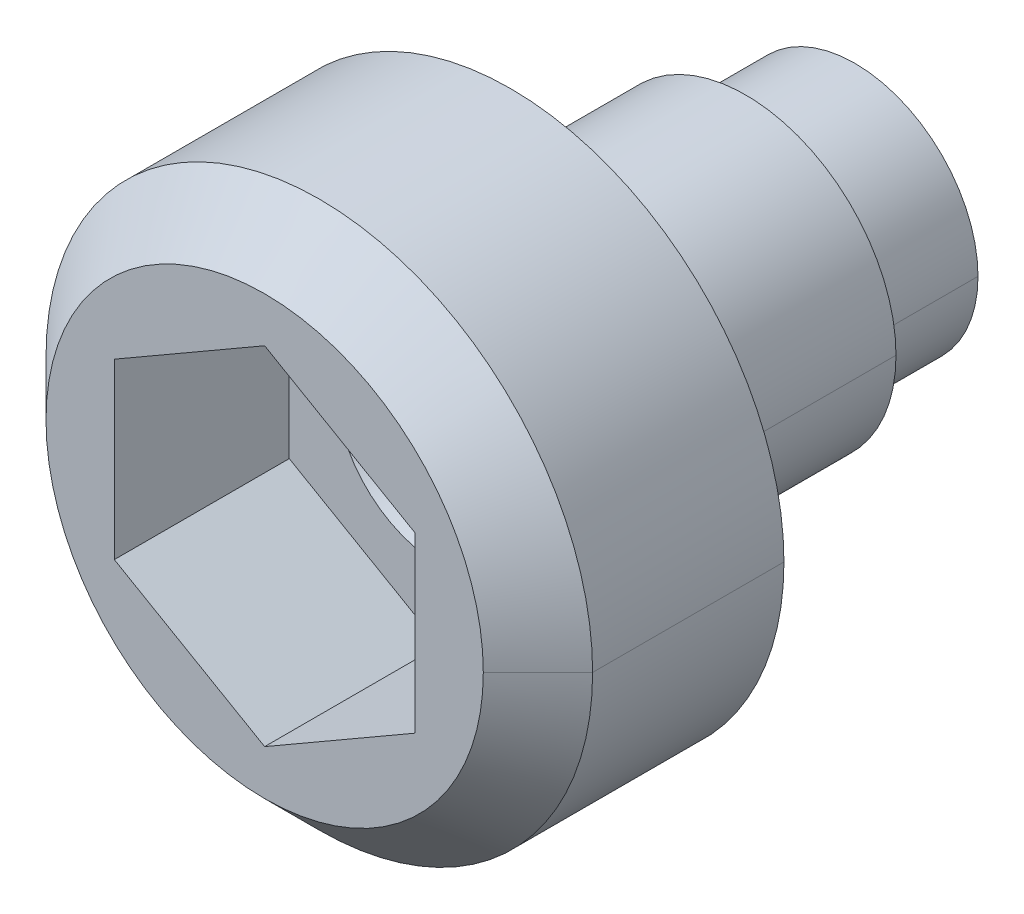
ISO-10303-21;
HEADER;
FILE_DESCRIPTION(('STEP AP214'),'2;1');
FILE_NAME('part.step','',(''),(''),'','','');
FILE_SCHEMA(('AUTOMOTIVE_DESIGN { 1 0 10303 214 1 1 1 1 }'));
ENDSEC;
DATA;
#1=APPLICATION_CONTEXT('core data for automotive mechanical design processes');
#2=APPLICATION_PROTOCOL_DEFINITION('international standard','automotive_design',2000,#1);
#3=PRODUCT_CONTEXT('',#1,'mechanical');
#4=PRODUCT('Part','Part','',(#3));
#5=PRODUCT_RELATED_PRODUCT_CATEGORY('part','',(#4));
#6=PRODUCT_DEFINITION_FORMATION('','',#4);
#7=PRODUCT_DEFINITION_CONTEXT('part definition',#1,'design');
#8=PRODUCT_DEFINITION('design','',#6,#7);
#9=PRODUCT_DEFINITION_SHAPE('','',#8);
#10=(LENGTH_UNIT() NAMED_UNIT(*) SI_UNIT(.MILLI.,.METRE.));
#11=(NAMED_UNIT(*) PLANE_ANGLE_UNIT() SI_UNIT($,.RADIAN.));
#12=(NAMED_UNIT(*) SI_UNIT($,.STERADIAN.) SOLID_ANGLE_UNIT());
#13=UNCERTAINTY_MEASURE_WITH_UNIT(LENGTH_MEASURE(1.E-05),#10,'distance_accuracy_value','');
#14=(GEOMETRIC_REPRESENTATION_CONTEXT(3) GLOBAL_UNCERTAINTY_ASSIGNED_CONTEXT((#13)) GLOBAL_UNIT_ASSIGNED_CONTEXT((#10,
#11,#12)) REPRESENTATION_CONTEXT('',''));
#15=CARTESIAN_POINT('',(0.,0.,0.));
#16=DIRECTION('',(0.,0.,1.));
#17=DIRECTION('',(1.,0.,0.));
#18=AXIS2_PLACEMENT_3D('',#15,#16,#17);
#19=CARTESIAN_POINT('',(0.,0.,-3.674));
#20=DIRECTION('',(0.,0.,1.));
#21=DIRECTION('',(1.,0.,0.));
#22=AXIS2_PLACEMENT_3D('',#19,#20,#21);
#23=CYLINDRICAL_SURFACE('',#22,1.6);
#24=DIRECTION('',(0.,0.,1.));
#25=VECTOR('',#24,1.);
#26=CARTESIAN_POINT('',(-1.6,0.,-3.674));
#27=LINE('',#26,#25);
#28=CARTESIAN_POINT('',(-1.6,0.,-2.00000000001));
#29=VERTEX_POINT('',#28);
#30=CARTESIAN_POINT('',(-1.59999999999627,0.,5.29999999997699));
#31=VERTEX_POINT('',#30);
#32=EDGE_CURVE('E221',#29,#31,#27,.T.);
#33=ORIENTED_EDGE('',*,*,#32,.F.);
#34=CARTESIAN_POINT('',(0.,0.,-2.00000000001));
#35=DIRECTION('',(0.,0.,-1.));
#36=DIRECTION('',(1.,0.,0.));
#37=AXIS2_PLACEMENT_3D('',#34,#35,#36);
#38=CIRCLE('',#37,1.6);
#39=CARTESIAN_POINT('',(1.6,0.,-2.00000000001));
#40=VERTEX_POINT('',#39);
#41=EDGE_CURVE('E27',#29,#40,#38,.T.);
#42=ORIENTED_EDGE('',*,*,#41,.T.);
#43=DIRECTION('',(0.,0.,1.));
#44=VECTOR('',#43,1.);
#45=CARTESIAN_POINT('',(1.6,0.,-3.674));
#46=LINE('',#45,#44);
#47=CARTESIAN_POINT('',(1.59999999999627,0.,5.29999999997699));
#48=VERTEX_POINT('',#47);
#49=EDGE_CURVE('E225',#40,#48,#46,.T.);
#50=ORIENTED_EDGE('',*,*,#49,.T.);
#51=CARTESIAN_POINT('',(0.,0.,5.29999999997699));
#52=DIRECTION('',(0.,0.,1.));
#53=DIRECTION('',(0.,1.,0.));
#54=AXIS2_PLACEMENT_3D('',#51,#52,#53);
#55=CIRCLE('',#54,1.59999999999627);
#56=EDGE_CURVE('E11',#48,#31,#55,.T.);
#57=ORIENTED_EDGE('',*,*,#56,.T.);
#58=EDGE_LOOP('',(#33,#42,#50,#57));
#59=FACE_BOUND('',#58,.T.);
#60=ADVANCED_FACE('F16',(#59),#23,.F.);
#61=CARTESIAN_POINT('',(0.,0.,5.59999999995853));
#62=DIRECTION('',(0.,0.,1.));
#63=DIRECTION('',(1.,0.,0.));
#64=AXIS2_PLACEMENT_3D('',#61,#62,#63);
#65=CONICAL_SURFACE('',#64,1.89999999997781,0.785398163397448);
#66=DIRECTION('',(-0.707106781186548,0.,0.707106781186548));
#67=VECTOR('',#66,1.);
#68=CARTESIAN_POINT('',(-1.89999999997781,0.,5.59999999995853));
#69=LINE('',#68,#67);
#70=CARTESIAN_POINT('',(-1.90000000009149,0.,5.60000000007221));
#71=VERTEX_POINT('',#70);
#72=EDGE_CURVE('E236',#31,#71,#69,.T.);
#73=ORIENTED_EDGE('',*,*,#72,.F.);
#74=ORIENTED_EDGE('',*,*,#56,.F.);
#75=DIRECTION('',(0.707106781186548,0.,0.707106781186548));
#76=VECTOR('',#75,1.);
#77=CARTESIAN_POINT('',(1.89999999997781,0.,5.59999999995853));
#78=LINE('',#77,#76);
#79=CARTESIAN_POINT('',(1.90000000009149,0.,5.60000000007221));
#80=VERTEX_POINT('',#79);
#81=EDGE_CURVE('E367',#48,#80,#78,.T.);
#82=ORIENTED_EDGE('',*,*,#81,.T.);
#83=CARTESIAN_POINT('',(0.,0.,5.60000000007221));
#84=DIRECTION('',(0.,0.,-1.));
#85=DIRECTION('',(1.,0.,0.));
#86=AXIS2_PLACEMENT_3D('',#83,#84,#85);
#87=CIRCLE('',#86,1.90000000009149);
#88=EDGE_CURVE('E183',#71,#80,#87,.T.);
#89=ORIENTED_EDGE('',*,*,#88,.F.);
#90=EDGE_LOOP('',(#73,#74,#82,#89));
#91=FACE_BOUND('',#90,.T.);
#92=ADVANCED_FACE('F474',(#91),#65,.F.);
#93=CARTESIAN_POINT('',(0.,0.,-2.));
#94=DIRECTION('',(0.,0.,1.));
#95=DIRECTION('',(1.,0.,0.));
#96=AXIS2_PLACEMENT_3D('',#93,#94,#95);
#97=PLANE('',#96);
#98=CARTESIAN_POINT('',(0.,0.,-2.00000000001));
#99=DIRECTION('',(0.,0.,-1.));
#100=DIRECTION('',(1.,0.,0.));
#101=AXIS2_PLACEMENT_3D('',#98,#99,#100);
#102=CIRCLE('',#101,1.6);
#103=EDGE_CURVE('E226',#40,#29,#102,.T.);
#104=ORIENTED_EDGE('',*,*,#103,.F.);
#105=ORIENTED_EDGE('',*,*,#41,.F.);
#106=EDGE_LOOP('',(#104,#105));
#107=FACE_BOUND('',#106,.T.);
#108=CARTESIAN_POINT('',(0.,0.,-2.00000000001));
#109=DIRECTION('',(0.,0.,1.));
#110=DIRECTION('',(1.,0.,0.));
#111=AXIS2_PLACEMENT_3D('',#108,#109,#110);
#112=CIRCLE('',#111,2.25);
#113=CARTESIAN_POINT('',(2.25,0.,-2.00000000001));
#114=VERTEX_POINT('',#113);
#115=CARTESIAN_POINT('',(-2.25,0.,-2.00000000001));
#116=VERTEX_POINT('',#115);
#117=EDGE_CURVE('E178',#114,#116,#112,.T.);
#118=ORIENTED_EDGE('',*,*,#117,.F.);
#119=CARTESIAN_POINT('',(0.,0.,-2.00000000001));
#120=DIRECTION('',(0.,0.,1.));
#121=DIRECTION('',(1.,0.,0.));
#122=AXIS2_PLACEMENT_3D('',#119,#120,#121);
#123=CIRCLE('',#122,2.25);
#124=EDGE_CURVE('E174',#116,#114,#123,.T.);
#125=ORIENTED_EDGE('',*,*,#124,.F.);
#126=EDGE_LOOP('',(#118,#125));
#127=FACE_BOUND('',#126,.T.);
#128=ADVANCED_FACE('F176',(#107,#127),#97,.F.);
#129=CARTESIAN_POINT('',(0.,0.,5.6));
#130=DIRECTION('',(0.,0.,1.));
#131=DIRECTION('',(1.,0.,0.));
#132=AXIS2_PLACEMENT_3D('',#129,#130,#131);
#133=PLANE('',#132);
#134=CARTESIAN_POINT('',(0.,0.,5.60000000007221));
#135=DIRECTION('',(0.,0.,-1.));
#136=DIRECTION('',(1.,0.,0.));
#137=AXIS2_PLACEMENT_3D('',#134,#135,#136);
#138=CIRCLE('',#137,1.90000000009149);
#139=EDGE_CURVE('E379',#80,#71,#138,.T.);
#140=ORIENTED_EDGE('',*,*,#139,.T.);
#141=ORIENTED_EDGE('',*,*,#88,.T.);
#142=EDGE_LOOP('',(#140,#141));
#143=FACE_BOUND('',#142,.T.);
#144=DIRECTION('',(-0.866025403784429,0.500000000000017,0.));
#145=VECTOR('',#144,1.);
#146=CARTESIAN_POINT('',(0.,-3.175426480543,5.6));
#147=LINE('',#146,#145);
#148=CARTESIAN_POINT('',(0.,-3.17542648054283,5.6));
#149=VERTEX_POINT('',#148);
#150=CARTESIAN_POINT('',(-2.75000000000005,-1.58771324027109,5.6));
#151=VERTEX_POINT('',#150);
#152=EDGE_CURVE('E251',#149,#151,#147,.T.);
#153=ORIENTED_EDGE('',*,*,#152,.F.);
#154=DIRECTION('',(-0.866025403784429,-0.500000000000017,0.));
#155=VECTOR('',#154,1.);
#156=CARTESIAN_POINT('',(2.75,-1.587713240271,5.6));
#157=LINE('',#156,#155);
#158=CARTESIAN_POINT('',(2.75,-1.587713240271,5.6));
#159=VERTEX_POINT('',#158);
#160=EDGE_CURVE('E42',#159,#149,#157,.T.);
#161=ORIENTED_EDGE('',*,*,#160,.F.);
#162=DIRECTION('',(0.,-1.,0.));
#163=VECTOR('',#162,1.);
#164=CARTESIAN_POINT('',(2.75,1.587713240271,5.6));
#165=LINE('',#164,#163);
#166=CARTESIAN_POINT('',(2.75000000000005,1.58771324027109,5.6));
#167=VERTEX_POINT('',#166);
#168=EDGE_CURVE('E281',#167,#159,#165,.T.);
#169=ORIENTED_EDGE('',*,*,#168,.F.);
#170=DIRECTION('',(0.866025403784429,-0.500000000000017,0.));
#171=VECTOR('',#170,1.);
#172=CARTESIAN_POINT('',(0.,3.175426480543,5.6));
#173=LINE('',#172,#171);
#174=CARTESIAN_POINT('',(0.,3.17542648054292,5.6));
#175=VERTEX_POINT('',#174);
#176=EDGE_CURVE('E277',#175,#167,#173,.T.);
#177=ORIENTED_EDGE('',*,*,#176,.F.);
#178=DIRECTION('',(0.866025403784429,0.500000000000017,0.));
#179=VECTOR('',#178,1.);
#180=CARTESIAN_POINT('',(-2.75,1.587713240271,5.6));
#181=LINE('',#180,#179);
#182=CARTESIAN_POINT('',(-2.75,1.587713240271,5.6));
#183=VERTEX_POINT('',#182);
#184=EDGE_CURVE('E259',#183,#175,#181,.T.);
#185=ORIENTED_EDGE('',*,*,#184,.F.);
#186=DIRECTION('',(0.,1.,0.));
#187=VECTOR('',#186,1.);
#188=CARTESIAN_POINT('',(-2.75,-1.587713240271,5.6));
#189=LINE('',#188,#187);
#190=EDGE_CURVE('E285',#151,#183,#189,.T.);
#191=ORIENTED_EDGE('',*,*,#190,.F.);
#192=EDGE_LOOP('',(#153,#161,#169,#177,#185,#191));
#193=FACE_BOUND('',#192,.T.);
#194=ADVANCED_FACE('F310',(#143,#193),#133,.T.);
#195=CARTESIAN_POINT('',(0.,0.,-2.1));
#196=DIRECTION('',(0.,0.,1.));
#197=DIRECTION('',(1.,0.,0.));
#198=AXIS2_PLACEMENT_3D('',#195,#196,#197);
#199=CYLINDRICAL_SURFACE('',#198,2.25);
#200=DIRECTION('',(0.,0.,1.));
#201=VECTOR('',#200,1.);
#202=CARTESIAN_POINT('',(-2.25,0.,-2.1));
#203=LINE('',#202,#201);
#204=CARTESIAN_POINT('',(-2.25,0.,0.));
#205=VERTEX_POINT('',#204);
#206=EDGE_CURVE('E186',#116,#205,#203,.T.);
#207=ORIENTED_EDGE('',*,*,#206,.F.);
#208=ORIENTED_EDGE('',*,*,#124,.T.);
#209=DIRECTION('',(0.,0.,1.));
#210=VECTOR('',#209,1.);
#211=CARTESIAN_POINT('',(2.25,0.,-2.1));
#212=LINE('',#211,#210);
#213=CARTESIAN_POINT('',(2.25,0.,0.));
#214=VERTEX_POINT('',#213);
#215=EDGE_CURVE('E196',#114,#214,#212,.T.);
#216=ORIENTED_EDGE('',*,*,#215,.T.);
#217=CARTESIAN_POINT('',(0.,0.,0.));
#218=DIRECTION('',(0.,0.,1.));
#219=DIRECTION('',(1.,0.,0.));
#220=AXIS2_PLACEMENT_3D('',#217,#218,#219);
#221=CIRCLE('',#220,2.25);
#222=EDGE_CURVE('E188',#205,#214,#221,.T.);
#223=ORIENTED_EDGE('',*,*,#222,.F.);
#224=EDGE_LOOP('',(#207,#208,#216,#223));
#225=FACE_BOUND('',#224,.T.);
#226=ADVANCED_FACE('F187',(#225),#199,.T.);
#227=CARTESIAN_POINT('',(2.75,-1.587713240271,8.8));
#228=DIRECTION('',(-0.500000000000017,0.866025403784429,0.));
#229=DIRECTION('',(0.,0.,1.));
#230=AXIS2_PLACEMENT_3D('',#227,#228,#229);
#231=PLANE('',#230);
#232=DIRECTION('',(0.,0.,1.));
#233=VECTOR('',#232,1.);
#234=CARTESIAN_POINT('',(2.75,-1.587713240271,8.8));
#235=LINE('',#234,#233);
#236=CARTESIAN_POINT('',(2.75,-1.587713240271,8.8));
#237=VERTEX_POINT('',#236);
#238=EDGE_CURVE('E278',#159,#237,#235,.T.);
#239=ORIENTED_EDGE('',*,*,#238,.F.);
#240=ORIENTED_EDGE('',*,*,#160,.T.);
#241=DIRECTION('',(0.,0.,-1.));
#242=VECTOR('',#241,1.);
#243=CARTESIAN_POINT('',(0.,-3.175426480543,8.8));
#244=LINE('',#243,#242);
#245=CARTESIAN_POINT('',(0.,-3.17542648054283,8.8));
#246=VERTEX_POINT('',#245);
#247=EDGE_CURVE('E247',#246,#149,#244,.T.);
#248=ORIENTED_EDGE('',*,*,#247,.F.);
#249=DIRECTION('',(0.866025403784366,0.500000000000125,0.));
#250=VECTOR('',#249,1.);
#251=CARTESIAN_POINT('',(0.,-3.175426480543,8.8));
#252=LINE('',#251,#250);
#253=EDGE_CURVE('E212',#246,#237,#252,.T.);
#254=ORIENTED_EDGE('',*,*,#253,.T.);
#255=EDGE_LOOP('',(#239,#240,#248,#254));
#256=FACE_BOUND('',#255,.T.);
#257=ADVANCED_FACE('F483',(#256),#231,.T.);
#258=CARTESIAN_POINT('',(2.75,1.587713240271,8.8));
#259=DIRECTION('',(-1.,0.,0.));
#260=DIRECTION('',(0.,0.,1.));
#261=AXIS2_PLACEMENT_3D('',#258,#259,#260);
#262=PLANE('',#261);
#263=DIRECTION('',(0.,0.,1.));
#264=VECTOR('',#263,1.);
#265=CARTESIAN_POINT('',(2.7500000000002,1.58771324027134,8.8));
#266=LINE('',#265,#264);
#267=CARTESIAN_POINT('',(2.75000000000005,1.58771324027109,8.8));
#268=VERTEX_POINT('',#267);
#269=EDGE_CURVE('E295',#167,#268,#266,.T.);
#270=ORIENTED_EDGE('',*,*,#269,.F.);
#271=ORIENTED_EDGE('',*,*,#168,.T.);
#272=ORIENTED_EDGE('',*,*,#238,.T.);
#273=DIRECTION('',(0.,1.,0.));
#274=VECTOR('',#273,1.);
#275=CARTESIAN_POINT('',(2.75,0.,8.8));
#276=LINE('',#275,#274);
#277=EDGE_CURVE('E216',#237,#268,#276,.T.);
#278=ORIENTED_EDGE('',*,*,#277,.T.);
#279=EDGE_LOOP('',(#270,#271,#272,#278));
#280=FACE_BOUND('',#279,.T.);
#281=ADVANCED_FACE('F316',(#280),#262,.T.);
#282=CARTESIAN_POINT('',(0.,3.175426480543,8.8));
#283=DIRECTION('',(-0.500000000000017,-0.866025403784429,0.));
#284=DIRECTION('',(-0.866025403784429,0.500000000000017,0.));
#285=AXIS2_PLACEMENT_3D('',#282,#283,#284);
#286=PLANE('',#285);
#287=DIRECTION('',(0.,0.,1.));
#288=VECTOR('',#287,1.);
#289=CARTESIAN_POINT('',(1.9819215713035E-13,3.17542648054265,8.8));
#290=LINE('',#289,#288);
#291=CARTESIAN_POINT('',(0.,3.17542648054292,8.8));
#292=VERTEX_POINT('',#291);
#293=EDGE_CURVE('E263',#175,#292,#290,.T.);
#294=ORIENTED_EDGE('',*,*,#293,.F.);
#295=ORIENTED_EDGE('',*,*,#176,.T.);
#296=ORIENTED_EDGE('',*,*,#269,.T.);
#297=DIRECTION('',(-0.866025403784366,0.500000000000125,0.));
#298=VECTOR('',#297,1.);
#299=CARTESIAN_POINT('',(2.75,1.587713240271,8.8));
#300=LINE('',#299,#298);
#301=EDGE_CURVE('E217',#268,#292,#300,.T.);
#302=ORIENTED_EDGE('',*,*,#301,.T.);
#303=EDGE_LOOP('',(#294,#295,#296,#302));
#304=FACE_BOUND('',#303,.T.);
#305=ADVANCED_FACE('F308',(#304),#286,.T.);
#306=CARTESIAN_POINT('',(-2.75,1.587713240271,8.8));
#307=DIRECTION('',(0.500000000000017,-0.866025403784429,0.));
#308=DIRECTION('',(0.,0.,-1.));
#309=AXIS2_PLACEMENT_3D('',#306,#307,#308);
#310=PLANE('',#309);
#311=DIRECTION('',(0.,0.,1.));
#312=VECTOR('',#311,1.);
#313=CARTESIAN_POINT('',(-2.75,1.587713240271,8.8));
#314=LINE('',#313,#312);
#315=CARTESIAN_POINT('',(-2.75,1.587713240271,8.8));
#316=VERTEX_POINT('',#315);
#317=EDGE_CURVE('E264',#183,#316,#314,.T.);
#318=ORIENTED_EDGE('',*,*,#317,.F.);
#319=ORIENTED_EDGE('',*,*,#184,.T.);
#320=ORIENTED_EDGE('',*,*,#293,.T.);
#321=DIRECTION('',(-0.866025403784366,-0.500000000000125,0.));
#322=VECTOR('',#321,1.);
#323=CARTESIAN_POINT('',(0.,3.175426480543,8.8));
#324=LINE('',#323,#322);
#325=EDGE_CURVE('E210',#292,#316,#324,.T.);
#326=ORIENTED_EDGE('',*,*,#325,.T.);
#327=EDGE_LOOP('',(#318,#319,#320,#326));
#328=FACE_BOUND('',#327,.T.);
#329=ADVANCED_FACE('F493',(#328),#310,.T.);
#330=CARTESIAN_POINT('',(-2.75,-1.587713240271,8.8));
#331=DIRECTION('',(1.,0.,0.));
#332=DIRECTION('',(0.,1.,0.));
#333=AXIS2_PLACEMENT_3D('',#330,#331,#332);
#334=PLANE('',#333);
#335=DIRECTION('',(0.,0.,1.));
#336=VECTOR('',#335,1.);
#337=CARTESIAN_POINT('',(-2.7500000000002,-1.58771324027134,8.8));
#338=LINE('',#337,#336);
#339=CARTESIAN_POINT('',(-2.75000000000005,-1.58771324027109,8.8));
#340=VERTEX_POINT('',#339);
#341=EDGE_CURVE('E20',#151,#340,#338,.T.);
#342=ORIENTED_EDGE('',*,*,#341,.F.);
#343=ORIENTED_EDGE('',*,*,#190,.T.);
#344=ORIENTED_EDGE('',*,*,#317,.T.);
#345=DIRECTION('',(0.,-1.,0.));
#346=VECTOR('',#345,1.);
#347=CARTESIAN_POINT('',(-2.75,0.,8.8));
#348=LINE('',#347,#346);
#349=EDGE_CURVE('E255',#316,#340,#348,.T.);
#350=ORIENTED_EDGE('',*,*,#349,.T.);
#351=EDGE_LOOP('',(#342,#343,#344,#350));
#352=FACE_BOUND('',#351,.T.);
#353=ADVANCED_FACE('F489',(#352),#334,.T.);
#354=CARTESIAN_POINT('',(0.,-3.175426480543,8.8));
#355=DIRECTION('',(0.500000000000017,0.866025403784429,0.));
#356=DIRECTION('',(0.,0.,-1.));
#357=AXIS2_PLACEMENT_3D('',#354,#355,#356);
#358=PLANE('',#357);
#359=ORIENTED_EDGE('',*,*,#247,.T.);
#360=ORIENTED_EDGE('',*,*,#152,.T.);
#361=ORIENTED_EDGE('',*,*,#341,.T.);
#362=DIRECTION('',(0.866025403784366,-0.500000000000125,0.));
#363=VECTOR('',#362,1.);
#364=CARTESIAN_POINT('',(-2.75,-1.587713240271,8.8));
#365=LINE('',#364,#363);
#366=EDGE_CURVE('E215',#340,#246,#365,.T.);
#367=ORIENTED_EDGE('',*,*,#366,.T.);
#368=EDGE_LOOP('',(#359,#360,#361,#367));
#369=FACE_BOUND('',#368,.T.);
#370=ADVANCED_FACE('F492',(#369),#358,.T.);
#371=CARTESIAN_POINT('',(0.,0.,0.));
#372=DIRECTION('',(0.,0.,-1.));
#373=DIRECTION('',(0.,-1.,0.));
#374=AXIS2_PLACEMENT_3D('',#371,#372,#373);
#375=PLANE('',#374);
#376=CARTESIAN_POINT('',(0.,0.,0.));
#377=DIRECTION('',(0.,0.,1.));
#378=DIRECTION('',(1.,0.,0.));
#379=AXIS2_PLACEMENT_3D('',#376,#377,#378);
#380=CIRCLE('',#379,2.25);
#381=EDGE_CURVE('E193',#214,#205,#380,.T.);
#382=ORIENTED_EDGE('',*,*,#381,.T.);
#383=ORIENTED_EDGE('',*,*,#222,.T.);
#384=EDGE_LOOP('',(#382,#383));
#385=FACE_BOUND('',#384,.T.);
#386=CARTESIAN_POINT('',(0.,0.,0.));
#387=DIRECTION('',(0.,0.,1.));
#388=DIRECTION('',(-1.,0.,0.));
#389=AXIS2_PLACEMENT_3D('',#386,#387,#388);
#390=CIRCLE('',#389,2.75);
#391=CARTESIAN_POINT('',(-2.75,0.,0.));
#392=VERTEX_POINT('',#391);
#393=CARTESIAN_POINT('',(2.75,0.,0.));
#394=VERTEX_POINT('',#393);
#395=EDGE_CURVE('E240',#392,#394,#390,.T.);
#396=ORIENTED_EDGE('',*,*,#395,.F.);
#397=CARTESIAN_POINT('',(0.,0.,0.));
#398=DIRECTION('',(0.,0.,1.));
#399=DIRECTION('',(-1.,0.,0.));
#400=AXIS2_PLACEMENT_3D('',#397,#398,#399);
#401=CIRCLE('',#400,2.75);
#402=EDGE_CURVE('E206',#394,#392,#401,.T.);
#403=ORIENTED_EDGE('',*,*,#402,.F.);
#404=EDGE_LOOP('',(#396,#403));
#405=FACE_BOUND('',#404,.T.);
#406=ADVANCED_FACE('F513',(#385,#405),#375,.T.);
#407=CARTESIAN_POINT('',(0.,0.,8.8));
#408=DIRECTION('',(0.,0.,-1.));
#409=DIRECTION('',(0.,-1.,0.));
#410=AXIS2_PLACEMENT_3D('',#407,#408,#409);
#411=PLANE('',#410);
#412=ORIENTED_EDGE('',*,*,#349,.F.);
#413=ORIENTED_EDGE('',*,*,#325,.F.);
#414=ORIENTED_EDGE('',*,*,#301,.F.);
#415=ORIENTED_EDGE('',*,*,#277,.F.);
#416=ORIENTED_EDGE('',*,*,#253,.F.);
#417=ORIENTED_EDGE('',*,*,#366,.F.);
#418=EDGE_LOOP('',(#412,#413,#414,#415,#416,#417));
#419=FACE_BOUND('',#418,.T.);
#420=CARTESIAN_POINT('',(0.,0.,8.79999999995107));
#421=DIRECTION('',(0.,0.,-1.));
#422=DIRECTION('',(-1.,0.,0.));
#423=AXIS2_PLACEMENT_3D('',#420,#421,#422);
#424=CIRCLE('',#423,4.0000000000191);
#425=CARTESIAN_POINT('',(-4.0000000000191,0.,8.79999999995107));
#426=VERTEX_POINT('',#425);
#427=CARTESIAN_POINT('',(4.0000000000191,0.,8.79999999995107));
#428=VERTEX_POINT('',#427);
#429=EDGE_CURVE('E265',#426,#428,#424,.T.);
#430=ORIENTED_EDGE('',*,*,#429,.F.);
#431=CARTESIAN_POINT('',(0.,0.,8.79999999995107));
#432=DIRECTION('',(0.,0.,-1.));
#433=DIRECTION('',(-1.,0.,0.));
#434=AXIS2_PLACEMENT_3D('',#431,#432,#433);
#435=CIRCLE('',#434,4.0000000000191);
#436=EDGE_CURVE('E237',#428,#426,#435,.T.);
#437=ORIENTED_EDGE('',*,*,#436,.F.);
#438=EDGE_LOOP('',(#430,#437));
#439=FACE_BOUND('',#438,.T.);
#440=ADVANCED_FACE('F323',(#419,#439),#411,.F.);
#441=CARTESIAN_POINT('',(0.,0.,9.24));
#442=DIRECTION('',(0.,0.,-1.));
#443=DIRECTION('',(-1.,0.,0.));
#444=AXIS2_PLACEMENT_3D('',#441,#442,#443);
#445=CYLINDRICAL_SURFACE('',#444,2.75);
#446=DIRECTION('',(0.,0.,-1.));
#447=VECTOR('',#446,1.);
#448=CARTESIAN_POINT('',(2.75,0.,9.24));
#449=LINE('',#448,#447);
#450=CARTESIAN_POINT('',(2.75,0.,4.30000000001));
#451=VERTEX_POINT('',#450);
#452=EDGE_CURVE('E227',#451,#394,#449,.T.);
#453=ORIENTED_EDGE('',*,*,#452,.F.);
#454=CARTESIAN_POINT('',(0.,0.,4.30000000001));
#455=DIRECTION('',(0.,0.,1.));
#456=DIRECTION('',(-1.,0.,0.));
#457=AXIS2_PLACEMENT_3D('',#454,#455,#456);
#458=CIRCLE('',#457,2.75);
#459=CARTESIAN_POINT('',(-2.75,0.,4.30000000001));
#460=VERTEX_POINT('',#459);
#461=EDGE_CURVE('E241',#460,#451,#458,.T.);
#462=ORIENTED_EDGE('',*,*,#461,.F.);
#463=DIRECTION('',(0.,0.,-1.));
#464=VECTOR('',#463,1.);
#465=CARTESIAN_POINT('',(-2.75,0.,9.24));
#466=LINE('',#465,#464);
#467=EDGE_CURVE('E198',#460,#392,#466,.T.);
#468=ORIENTED_EDGE('',*,*,#467,.T.);
#469=ORIENTED_EDGE('',*,*,#395,.T.);
#470=EDGE_LOOP('',(#453,#462,#468,#469));
#471=FACE_BOUND('',#470,.T.);
#472=ADVANCED_FACE('F471',(#471),#445,.T.);
#473=CARTESIAN_POINT('',(0.,0.,7.8000000000884));
#474=DIRECTION('',(0.,0.,-1.));
#475=DIRECTION('',(-1.,0.,0.));
#476=AXIS2_PLACEMENT_3D('',#473,#474,#475);
#477=CONICAL_SURFACE('',#476,4.99999999993861,0.785398163425871);
#478=DIRECTION('',(0.707106781206645,0.,-0.70710678116645));
#479=VECTOR('',#478,1.);
#480=CARTESIAN_POINT('',(4.99999999993861,0.,7.8000000000884));
#481=LINE('',#480,#479);
#482=CARTESIAN_POINT('',(5.00000000001701,0.,7.80000000001));
#483=VERTEX_POINT('',#482);
#484=EDGE_CURVE('E269',#428,#483,#481,.T.);
#485=ORIENTED_EDGE('',*,*,#484,.F.);
#486=ORIENTED_EDGE('',*,*,#436,.T.);
#487=DIRECTION('',(-0.707106781206645,0.,-0.70710678116645));
#488=VECTOR('',#487,1.);
#489=CARTESIAN_POINT('',(-4.99999999993861,0.,7.8000000000884));
#490=LINE('',#489,#488);
#491=CARTESIAN_POINT('',(-5.00000000001701,0.,7.80000000001));
#492=VERTEX_POINT('',#491);
#493=EDGE_CURVE('E294',#426,#492,#490,.T.);
#494=ORIENTED_EDGE('',*,*,#493,.T.);
#495=CARTESIAN_POINT('',(0.,0.,7.80000000001));
#496=DIRECTION('',(0.,0.,-1.));
#497=DIRECTION('',(-1.,0.,0.));
#498=AXIS2_PLACEMENT_3D('',#495,#496,#497);
#499=CIRCLE('',#498,5.);
#500=EDGE_CURVE('E149',#483,#492,#499,.T.);
#501=ORIENTED_EDGE('',*,*,#500,.F.);
#502=EDGE_LOOP('',(#485,#486,#494,#501));
#503=FACE_BOUND('',#502,.T.);
#504=ADVANCED_FACE('F18',(#503),#477,.T.);
#505=CARTESIAN_POINT('',(0.,0.,4.3));
#506=DIRECTION('',(0.,0.,-1.));
#507=DIRECTION('',(0.,-1.,0.));
#508=AXIS2_PLACEMENT_3D('',#505,#506,#507);
#509=PLANE('',#508);
#510=ORIENTED_EDGE('',*,*,#461,.T.);
#511=CARTESIAN_POINT('',(0.,0.,4.30000000001));
#512=DIRECTION('',(0.,0.,1.));
#513=DIRECTION('',(-1.,0.,0.));
#514=AXIS2_PLACEMENT_3D('',#511,#512,#513);
#515=CIRCLE('',#514,2.75);
#516=EDGE_CURVE('E231',#451,#460,#515,.T.);
#517=ORIENTED_EDGE('',*,*,#516,.T.);
#518=EDGE_LOOP('',(#510,#517));
#519=FACE_BOUND('',#518,.T.);
#520=CARTESIAN_POINT('',(0.,0.,4.30000000001));
#521=DIRECTION('',(0.,0.,1.));
#522=DIRECTION('',(-1.,0.,0.));
#523=AXIS2_PLACEMENT_3D('',#520,#521,#522);
#524=CIRCLE('',#523,5.);
#525=CARTESIAN_POINT('',(-5.,0.,4.30000000001));
#526=VERTEX_POINT('',#525);
#527=CARTESIAN_POINT('',(5.,0.,4.30000000001));
#528=VERTEX_POINT('',#527);
#529=EDGE_CURVE('E274',#526,#528,#524,.T.);
#530=ORIENTED_EDGE('',*,*,#529,.F.);
#531=CARTESIAN_POINT('',(0.,0.,4.30000000001));
#532=DIRECTION('',(0.,0.,1.));
#533=DIRECTION('',(-1.,0.,0.));
#534=AXIS2_PLACEMENT_3D('',#531,#532,#533);
#535=CIRCLE('',#534,5.);
#536=EDGE_CURVE('E339',#528,#526,#535,.T.);
#537=ORIENTED_EDGE('',*,*,#536,.F.);
#538=EDGE_LOOP('',(#530,#537));
#539=FACE_BOUND('',#538,.T.);
#540=ADVANCED_FACE('F460',(#519,#539),#509,.T.);
#541=CARTESIAN_POINT('',(0.,0.,9.24));
#542=DIRECTION('',(0.,0.,-1.));
#543=DIRECTION('',(-1.,0.,0.));
#544=AXIS2_PLACEMENT_3D('',#541,#542,#543);
#545=CYLINDRICAL_SURFACE('',#544,5.);
#546=DIRECTION('',(0.,0.,-1.));
#547=VECTOR('',#546,1.);
#548=CARTESIAN_POINT('',(5.,0.,9.24));
#549=LINE('',#548,#547);
#550=EDGE_CURVE('E336',#483,#528,#549,.T.);
#551=ORIENTED_EDGE('',*,*,#550,.F.);
#552=ORIENTED_EDGE('',*,*,#500,.T.);
#553=DIRECTION('',(0.,0.,-1.));
#554=VECTOR('',#553,1.);
#555=CARTESIAN_POINT('',(-5.,0.,9.24));
#556=LINE('',#555,#554);
#557=EDGE_CURVE('E270',#492,#526,#556,.T.);
#558=ORIENTED_EDGE('',*,*,#557,.T.);
#559=ORIENTED_EDGE('',*,*,#529,.T.);
#560=EDGE_LOOP('',(#551,#552,#558,#559));
#561=FACE_BOUND('',#560,.T.);
#562=ADVANCED_FACE('F454',(#561),#545,.T.);
#563=CARTESIAN_POINT('',(0.,0.,-3.674));
#564=DIRECTION('',(0.,0.,1.));
#565=DIRECTION('',(1.,0.,0.));
#566=AXIS2_PLACEMENT_3D('',#563,#564,#565);
#567=CYLINDRICAL_SURFACE('',#566,1.6);
#568=ORIENTED_EDGE('',*,*,#103,.T.);
#569=ORIENTED_EDGE('',*,*,#32,.T.);
#570=CARTESIAN_POINT('',(0.,0.,5.29999999997699));
#571=DIRECTION('',(0.,0.,1.));
#572=DIRECTION('',(0.,1.,0.));
#573=AXIS2_PLACEMENT_3D('',#570,#571,#572);
#574=CIRCLE('',#573,1.59999999999627);
#575=EDGE_CURVE('E232',#31,#48,#574,.T.);
#576=ORIENTED_EDGE('',*,*,#575,.T.);
#577=ORIENTED_EDGE('',*,*,#49,.F.);
#578=EDGE_LOOP('',(#568,#569,#576,#577));
#579=FACE_BOUND('',#578,.T.);
#580=ADVANCED_FACE('F469',(#579),#567,.F.);
#581=CARTESIAN_POINT('',(0.,0.,5.59999999995853));
#582=DIRECTION('',(0.,0.,1.));
#583=DIRECTION('',(1.,0.,0.));
#584=AXIS2_PLACEMENT_3D('',#581,#582,#583);
#585=CONICAL_SURFACE('',#584,1.89999999997781,0.785398163397448);
#586=ORIENTED_EDGE('',*,*,#575,.F.);
#587=ORIENTED_EDGE('',*,*,#72,.T.);
#588=ORIENTED_EDGE('',*,*,#139,.F.);
#589=ORIENTED_EDGE('',*,*,#81,.F.);
#590=EDGE_LOOP('',(#586,#587,#588,#589));
#591=FACE_BOUND('',#590,.T.);
#592=ADVANCED_FACE('F523',(#591),#585,.F.);
#593=CARTESIAN_POINT('',(0.,0.,-2.1));
#594=DIRECTION('',(0.,0.,1.));
#595=DIRECTION('',(1.,0.,0.));
#596=AXIS2_PLACEMENT_3D('',#593,#594,#595);
#597=CYLINDRICAL_SURFACE('',#596,2.25);
#598=ORIENTED_EDGE('',*,*,#117,.T.);
#599=ORIENTED_EDGE('',*,*,#206,.T.);
#600=ORIENTED_EDGE('',*,*,#381,.F.);
#601=ORIENTED_EDGE('',*,*,#215,.F.);
#602=EDGE_LOOP('',(#598,#599,#600,#601));
#603=FACE_BOUND('',#602,.T.);
#604=ADVANCED_FACE('F195',(#603),#597,.T.);
#605=CARTESIAN_POINT('',(0.,0.,9.24));
#606=DIRECTION('',(0.,0.,-1.));
#607=DIRECTION('',(-1.,0.,0.));
#608=AXIS2_PLACEMENT_3D('',#605,#606,#607);
#609=CYLINDRICAL_SURFACE('',#608,2.75);
#610=ORIENTED_EDGE('',*,*,#516,.F.);
#611=ORIENTED_EDGE('',*,*,#452,.T.);
#612=ORIENTED_EDGE('',*,*,#402,.T.);
#613=ORIENTED_EDGE('',*,*,#467,.F.);
#614=EDGE_LOOP('',(#610,#611,#612,#613));
#615=FACE_BOUND('',#614,.T.);
#616=ADVANCED_FACE('F495',(#615),#609,.T.);
#617=CARTESIAN_POINT('',(0.,0.,7.8000000000884));
#618=DIRECTION('',(0.,0.,-1.));
#619=DIRECTION('',(-1.,0.,0.));
#620=AXIS2_PLACEMENT_3D('',#617,#618,#619);
#621=CONICAL_SURFACE('',#620,4.99999999993861,0.785398163425871);
#622=ORIENTED_EDGE('',*,*,#429,.T.);
#623=ORIENTED_EDGE('',*,*,#484,.T.);
#624=CARTESIAN_POINT('',(0.,0.,7.80000000001));
#625=DIRECTION('',(0.,0.,-1.));
#626=DIRECTION('',(-1.,0.,0.));
#627=AXIS2_PLACEMENT_3D('',#624,#625,#626);
#628=CIRCLE('',#627,5.);
#629=EDGE_CURVE('E340',#492,#483,#628,.T.);
#630=ORIENTED_EDGE('',*,*,#629,.F.);
#631=ORIENTED_EDGE('',*,*,#493,.F.);
#632=EDGE_LOOP('',(#622,#623,#630,#631));
#633=FACE_BOUND('',#632,.T.);
#634=ADVANCED_FACE('F451',(#633),#621,.T.);
#635=CARTESIAN_POINT('',(0.,0.,9.24));
#636=DIRECTION('',(0.,0.,-1.));
#637=DIRECTION('',(-1.,0.,0.));
#638=AXIS2_PLACEMENT_3D('',#635,#636,#637);
#639=CYLINDRICAL_SURFACE('',#638,5.);
#640=ORIENTED_EDGE('',*,*,#629,.T.);
#641=ORIENTED_EDGE('',*,*,#550,.T.);
#642=ORIENTED_EDGE('',*,*,#536,.T.);
#643=ORIENTED_EDGE('',*,*,#557,.F.);
#644=EDGE_LOOP('',(#640,#641,#642,#643));
#645=FACE_BOUND('',#644,.T.);
#646=ADVANCED_FACE('F458',(#645),#639,.T.);
#647=CLOSED_SHELL('',(#60,#92,#128,#194,#226,#257,#281,#305,#329,#353,#370,#406,#440,#472,#504,
#540,#562,#580,#592,#604,#616,#634,#646));
#648=MANIFOLD_SOLID_BREP('B1',#647);
#649=ADVANCED_BREP_SHAPE_REPRESENTATION('',(#18,#648),#14);
#650=SHAPE_DEFINITION_REPRESENTATION(#9,#649);
ENDSEC;
END-ISO-10303-21;
